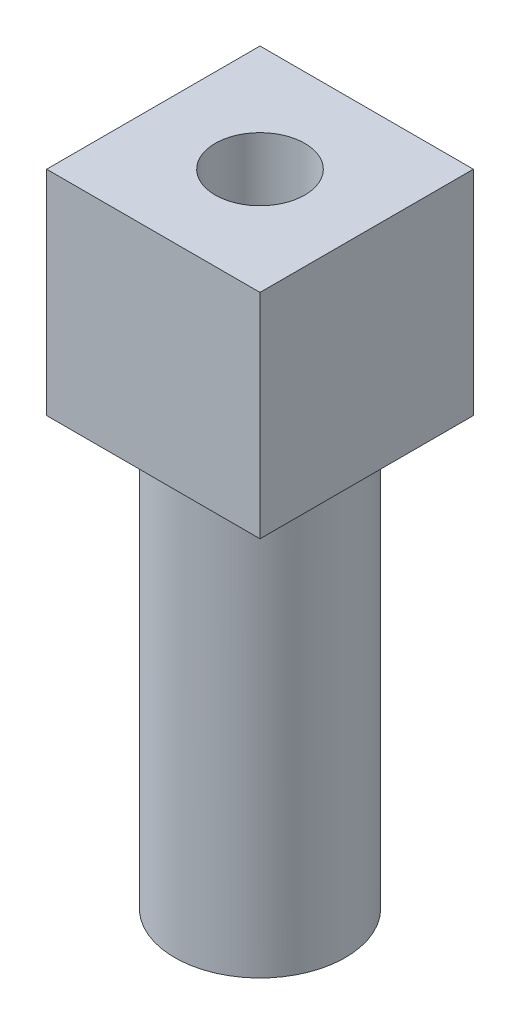
ISO-10303-21;
HEADER;
FILE_DESCRIPTION(('STEP AP214'),'2;1');
FILE_NAME('part.step','',(''),(''),'','','');
FILE_SCHEMA(('AUTOMOTIVE_DESIGN { 1 0 10303 214 1 1 1 1 }'));
ENDSEC;
DATA;
#1=APPLICATION_CONTEXT('core data for automotive mechanical design processes');
#2=APPLICATION_PROTOCOL_DEFINITION('international standard','automotive_design',2000,#1);
#3=PRODUCT_CONTEXT('',#1,'mechanical');
#4=PRODUCT('Part','Part','',(#3));
#5=PRODUCT_RELATED_PRODUCT_CATEGORY('part','',(#4));
#6=PRODUCT_DEFINITION_FORMATION('','',#4);
#7=PRODUCT_DEFINITION_CONTEXT('part definition',#1,'design');
#8=PRODUCT_DEFINITION('design','',#6,#7);
#9=PRODUCT_DEFINITION_SHAPE('','',#8);
#10=(LENGTH_UNIT() NAMED_UNIT(*) SI_UNIT(.MILLI.,.METRE.));
#11=(NAMED_UNIT(*) PLANE_ANGLE_UNIT() SI_UNIT($,.RADIAN.));
#12=(NAMED_UNIT(*) SI_UNIT($,.STERADIAN.) SOLID_ANGLE_UNIT());
#13=UNCERTAINTY_MEASURE_WITH_UNIT(LENGTH_MEASURE(1.E-05),#10,'distance_accuracy_value','');
#14=(GEOMETRIC_REPRESENTATION_CONTEXT(3) GLOBAL_UNCERTAINTY_ASSIGNED_CONTEXT((#13)) GLOBAL_UNIT_ASSIGNED_CONTEXT((#10,
#11,#12)) REPRESENTATION_CONTEXT('',''));
#15=CARTESIAN_POINT('',(0.,0.,0.));
#16=DIRECTION('',(0.,0.,1.));
#17=DIRECTION('',(1.,0.,0.));
#18=AXIS2_PLACEMENT_3D('',#15,#16,#17);
#19=CARTESIAN_POINT('',(0.,0.,0.));
#20=DIRECTION('',(0.,-1.,0.));
#21=DIRECTION('',(0.,0.,-1.));
#22=AXIS2_PLACEMENT_3D('',#19,#20,#21);
#23=PLANE('',#22);
#24=CARTESIAN_POINT('',(0.,0.,0.));
#25=DIRECTION('',(0.,1.,0.));
#26=DIRECTION('',(0.,0.,1.));
#27=AXIS2_PLACEMENT_3D('',#24,#25,#26);
#28=CIRCLE('',#27,2.09999999999999);
#29=CARTESIAN_POINT('',(0.,0.,2.09999999999999));
#30=VERTEX_POINT('',#29);
#31=EDGE_CURVE('E106',#30,#30,#28,.T.);
#32=ORIENTED_EDGE('',*,*,#31,.T.);
#33=EDGE_LOOP('',(#32));
#34=FACE_BOUND('',#33,.T.);
#35=CARTESIAN_POINT('',(0.,0.,0.));
#36=DIRECTION('',(0.,-1.,0.));
#37=DIRECTION('',(0.,0.,-1.));
#38=AXIS2_PLACEMENT_3D('',#35,#36,#37);
#39=CIRCLE('',#38,4.);
#40=CARTESIAN_POINT('',(0.,0.,-4.));
#41=VERTEX_POINT('',#40);
#42=EDGE_CURVE('E11',#41,#41,#39,.T.);
#43=ORIENTED_EDGE('',*,*,#42,.T.);
#44=EDGE_LOOP('',(#43));
#45=FACE_BOUND('',#44,.T.);
#46=ADVANCED_FACE('F36',(#34,#45),#23,.T.);
#47=CARTESIAN_POINT('',(0.,-2.45930268585907,0.));
#48=DIRECTION('',(0.,-1.,0.));
#49=DIRECTION('',(0.,0.,-1.));
#50=AXIS2_PLACEMENT_3D('',#47,#48,#49);
#51=CYLINDRICAL_SURFACE('',#50,4.);
#52=CARTESIAN_POINT('',(0.,20.,0.));
#53=DIRECTION('',(0.,1.,0.));
#54=DIRECTION('',(0.,0.,1.));
#55=AXIS2_PLACEMENT_3D('',#52,#53,#54);
#56=CIRCLE('',#55,4.);
#57=CARTESIAN_POINT('',(0.,20.,4.));
#58=VERTEX_POINT('',#57);
#59=EDGE_CURVE('E44',#58,#58,#56,.F.);
#60=ORIENTED_EDGE('',*,*,#59,.T.);
#61=EDGE_LOOP('',(#60));
#62=FACE_BOUND('',#61,.T.);
#63=ORIENTED_EDGE('',*,*,#42,.F.);
#64=EDGE_LOOP('',(#63));
#65=FACE_BOUND('',#64,.T.);
#66=ADVANCED_FACE('F115',(#62,#65),#51,.T.);
#67=CARTESIAN_POINT('',(-5.,30.,-5.));
#68=DIRECTION('',(1.,0.,0.));
#69=DIRECTION('',(0.,0.,-1.));
#70=AXIS2_PLACEMENT_3D('',#67,#68,#69);
#71=PLANE('',#70);
#72=DIRECTION('',(0.,0.,1.));
#73=VECTOR('',#72,1.);
#74=CARTESIAN_POINT('',(-5.,20.,-5.));
#75=LINE('',#74,#73);
#76=CARTESIAN_POINT('',(-5.,20.,-5.));
#77=VERTEX_POINT('',#76);
#78=CARTESIAN_POINT('',(-5.,20.,5.));
#79=VERTEX_POINT('',#78);
#80=EDGE_CURVE('E103',#77,#79,#75,.T.);
#81=ORIENTED_EDGE('',*,*,#80,.T.);
#82=DIRECTION('',(0.,-1.,0.));
#83=VECTOR('',#82,1.);
#84=CARTESIAN_POINT('',(-5.,30.,5.));
#85=LINE('',#84,#83);
#86=CARTESIAN_POINT('',(-5.,30.,5.));
#87=VERTEX_POINT('',#86);
#88=EDGE_CURVE('E94',#87,#79,#85,.T.);
#89=ORIENTED_EDGE('',*,*,#88,.F.);
#90=DIRECTION('',(0.,0.,1.));
#91=VECTOR('',#90,1.);
#92=CARTESIAN_POINT('',(-5.,30.,-5.));
#93=LINE('',#92,#91);
#94=CARTESIAN_POINT('',(-5.,30.,-5.));
#95=VERTEX_POINT('',#94);
#96=EDGE_CURVE('E88',#95,#87,#93,.T.);
#97=ORIENTED_EDGE('',*,*,#96,.F.);
#98=DIRECTION('',(0.,-1.,0.));
#99=VECTOR('',#98,1.);
#100=CARTESIAN_POINT('',(-5.,30.,-5.));
#101=LINE('',#100,#99);
#102=EDGE_CURVE('E99',#95,#77,#101,.T.);
#103=ORIENTED_EDGE('',*,*,#102,.T.);
#104=EDGE_LOOP('',(#81,#89,#97,#103));
#105=FACE_BOUND('',#104,.T.);
#106=ADVANCED_FACE('F125',(#105),#71,.F.);
#107=CARTESIAN_POINT('',(-5.,30.,5.));
#108=DIRECTION('',(0.,0.,-1.));
#109=DIRECTION('',(-1.,0.,0.));
#110=AXIS2_PLACEMENT_3D('',#107,#108,#109);
#111=PLANE('',#110);
#112=DIRECTION('',(1.,0.,0.));
#113=VECTOR('',#112,1.);
#114=CARTESIAN_POINT('',(-5.,20.,5.));
#115=LINE('',#114,#113);
#116=CARTESIAN_POINT('',(5.,20.,5.));
#117=VERTEX_POINT('',#116);
#118=EDGE_CURVE('E93',#79,#117,#115,.T.);
#119=ORIENTED_EDGE('',*,*,#118,.T.);
#120=DIRECTION('',(0.,-1.,0.));
#121=VECTOR('',#120,1.);
#122=CARTESIAN_POINT('',(5.,30.,5.));
#123=LINE('',#122,#121);
#124=CARTESIAN_POINT('',(5.,30.,5.));
#125=VERTEX_POINT('',#124);
#126=EDGE_CURVE('E91',#125,#117,#123,.T.);
#127=ORIENTED_EDGE('',*,*,#126,.F.);
#128=DIRECTION('',(1.,0.,0.));
#129=VECTOR('',#128,1.);
#130=CARTESIAN_POINT('',(-5.,30.,5.));
#131=LINE('',#130,#129);
#132=EDGE_CURVE('E83',#87,#125,#131,.T.);
#133=ORIENTED_EDGE('',*,*,#132,.F.);
#134=ORIENTED_EDGE('',*,*,#88,.T.);
#135=EDGE_LOOP('',(#119,#127,#133,#134));
#136=FACE_BOUND('',#135,.T.);
#137=ADVANCED_FACE('F92',(#136),#111,.F.);
#138=CARTESIAN_POINT('',(5.,30.,-5.));
#139=DIRECTION('',(-1.,0.,0.));
#140=DIRECTION('',(0.,0.,1.));
#141=AXIS2_PLACEMENT_3D('',#138,#139,#140);
#142=PLANE('',#141);
#143=DIRECTION('',(0.,0.,-1.));
#144=VECTOR('',#143,1.);
#145=CARTESIAN_POINT('',(5.,20.,-5.));
#146=LINE('',#145,#144);
#147=CARTESIAN_POINT('',(5.,20.,-5.));
#148=VERTEX_POINT('',#147);
#149=EDGE_CURVE('E69',#117,#148,#146,.T.);
#150=ORIENTED_EDGE('',*,*,#149,.T.);
#151=DIRECTION('',(0.,-1.,0.));
#152=VECTOR('',#151,1.);
#153=CARTESIAN_POINT('',(5.,30.,-5.));
#154=LINE('',#153,#152);
#155=CARTESIAN_POINT('',(5.,30.,-5.));
#156=VERTEX_POINT('',#155);
#157=EDGE_CURVE('E95',#156,#148,#154,.T.);
#158=ORIENTED_EDGE('',*,*,#157,.F.);
#159=DIRECTION('',(0.,0.,-1.));
#160=VECTOR('',#159,1.);
#161=CARTESIAN_POINT('',(5.,30.,-5.));
#162=LINE('',#161,#160);
#163=EDGE_CURVE('E86',#125,#156,#162,.T.);
#164=ORIENTED_EDGE('',*,*,#163,.F.);
#165=ORIENTED_EDGE('',*,*,#126,.T.);
#166=EDGE_LOOP('',(#150,#158,#164,#165));
#167=FACE_BOUND('',#166,.T.);
#168=ADVANCED_FACE('F97',(#167),#142,.F.);
#169=CARTESIAN_POINT('',(-5.,30.,-5.));
#170=DIRECTION('',(0.,0.,1.));
#171=DIRECTION('',(1.,0.,0.));
#172=AXIS2_PLACEMENT_3D('',#169,#170,#171);
#173=PLANE('',#172);
#174=DIRECTION('',(-1.,0.,0.));
#175=VECTOR('',#174,1.);
#176=CARTESIAN_POINT('',(-5.,20.,-5.));
#177=LINE('',#176,#175);
#178=EDGE_CURVE('E75',#148,#77,#177,.T.);
#179=ORIENTED_EDGE('',*,*,#178,.T.);
#180=ORIENTED_EDGE('',*,*,#102,.F.);
#181=DIRECTION('',(-1.,0.,0.));
#182=VECTOR('',#181,1.);
#183=CARTESIAN_POINT('',(-5.,30.,-5.));
#184=LINE('',#183,#182);
#185=EDGE_CURVE('E52',#156,#95,#184,.T.);
#186=ORIENTED_EDGE('',*,*,#185,.F.);
#187=ORIENTED_EDGE('',*,*,#157,.T.);
#188=EDGE_LOOP('',(#179,#180,#186,#187));
#189=FACE_BOUND('',#188,.T.);
#190=ADVANCED_FACE('F126',(#189),#173,.F.);
#191=CARTESIAN_POINT('',(0.,30.,0.));
#192=DIRECTION('',(0.,1.,0.));
#193=DIRECTION('',(0.,0.,1.));
#194=AXIS2_PLACEMENT_3D('',#191,#192,#193);
#195=PLANE('',#194);
#196=CARTESIAN_POINT('',(0.,30.,0.));
#197=DIRECTION('',(0.,1.,0.));
#198=DIRECTION('',(0.,0.,1.));
#199=AXIS2_PLACEMENT_3D('',#196,#197,#198);
#200=CIRCLE('',#199,2.09999999999999);
#201=CARTESIAN_POINT('',(0.,30.,2.09999999999999));
#202=VERTEX_POINT('',#201);
#203=EDGE_CURVE('E146',#202,#202,#200,.T.);
#204=ORIENTED_EDGE('',*,*,#203,.F.);
#205=EDGE_LOOP('',(#204));
#206=FACE_BOUND('',#205,.T.);
#207=ORIENTED_EDGE('',*,*,#96,.T.);
#208=ORIENTED_EDGE('',*,*,#132,.T.);
#209=ORIENTED_EDGE('',*,*,#163,.T.);
#210=ORIENTED_EDGE('',*,*,#185,.T.);
#211=EDGE_LOOP('',(#207,#208,#209,#210));
#212=FACE_BOUND('',#211,.T.);
#213=ADVANCED_FACE('F84',(#206,#212),#195,.T.);
#214=CARTESIAN_POINT('',(0.,20.,0.));
#215=DIRECTION('',(0.,1.,0.));
#216=DIRECTION('',(0.,0.,1.));
#217=AXIS2_PLACEMENT_3D('',#214,#215,#216);
#218=PLANE('',#217);
#219=ORIENTED_EDGE('',*,*,#59,.F.);
#220=EDGE_LOOP('',(#219));
#221=FACE_BOUND('',#220,.T.);
#222=ORIENTED_EDGE('',*,*,#80,.F.);
#223=ORIENTED_EDGE('',*,*,#178,.F.);
#224=ORIENTED_EDGE('',*,*,#149,.F.);
#225=ORIENTED_EDGE('',*,*,#118,.F.);
#226=EDGE_LOOP('',(#222,#223,#224,#225));
#227=FACE_BOUND('',#226,.T.);
#228=ADVANCED_FACE('F118',(#221,#227),#218,.F.);
#229=CARTESIAN_POINT('',(0.,30.,0.));
#230=DIRECTION('',(0.,1.,0.));
#231=DIRECTION('',(0.,0.,1.));
#232=AXIS2_PLACEMENT_3D('',#229,#230,#231);
#233=CYLINDRICAL_SURFACE('',#232,2.09999999999999);
#234=ORIENTED_EDGE('',*,*,#31,.F.);
#235=EDGE_LOOP('',(#234));
#236=FACE_BOUND('',#235,.T.);
#237=ORIENTED_EDGE('',*,*,#203,.T.);
#238=EDGE_LOOP('',(#237));
#239=FACE_BOUND('',#238,.T.);
#240=ADVANCED_FACE('F121',(#236,#239),#233,.F.);
#241=CLOSED_SHELL('',(#46,#66,#106,#137,#168,#190,#213,#228,#240));
#242=MANIFOLD_SOLID_BREP('B2',#241);
#243=ADVANCED_BREP_SHAPE_REPRESENTATION('',(#18,#242),#14);
#244=SHAPE_DEFINITION_REPRESENTATION(#9,#243);
ENDSEC;
END-ISO-10303-21;
